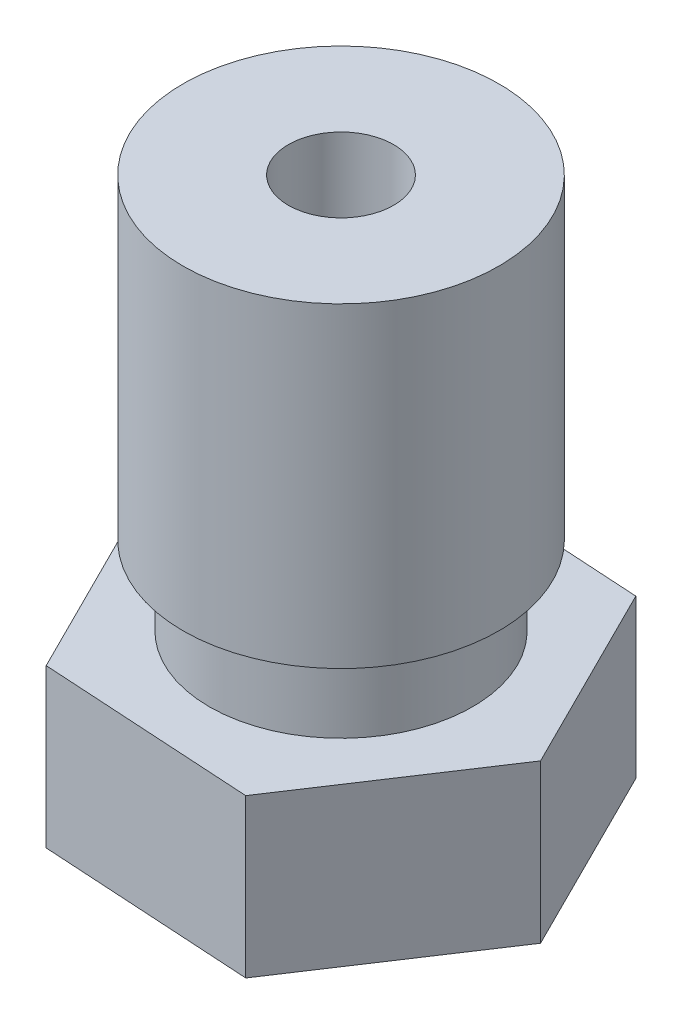
ISO-10303-21;
HEADER;
FILE_DESCRIPTION(('STEP AP214'),'2;1');
FILE_NAME('part.step','',(''),(''),'','','');
FILE_SCHEMA(('AUTOMOTIVE_DESIGN { 1 0 10303 214 1 1 1 1 }'));
ENDSEC;
DATA;
#1=APPLICATION_CONTEXT('core data for automotive mechanical design processes');
#2=APPLICATION_PROTOCOL_DEFINITION('international standard','automotive_design',2000,#1);
#3=PRODUCT_CONTEXT('',#1,'mechanical');
#4=PRODUCT('Part','Part','',(#3));
#5=PRODUCT_RELATED_PRODUCT_CATEGORY('part','',(#4));
#6=PRODUCT_DEFINITION_FORMATION('','',#4);
#7=PRODUCT_DEFINITION_CONTEXT('part definition',#1,'design');
#8=PRODUCT_DEFINITION('design','',#6,#7);
#9=PRODUCT_DEFINITION_SHAPE('','',#8);
#10=(LENGTH_UNIT() NAMED_UNIT(*) SI_UNIT(.MILLI.,.METRE.));
#11=(NAMED_UNIT(*) PLANE_ANGLE_UNIT() SI_UNIT($,.RADIAN.));
#12=(NAMED_UNIT(*) SI_UNIT($,.STERADIAN.) SOLID_ANGLE_UNIT());
#13=UNCERTAINTY_MEASURE_WITH_UNIT(LENGTH_MEASURE(1.E-05),#10,'distance_accuracy_value','');
#14=(GEOMETRIC_REPRESENTATION_CONTEXT(3) GLOBAL_UNCERTAINTY_ASSIGNED_CONTEXT((#13)) GLOBAL_UNIT_ASSIGNED_CONTEXT((#10,
#11,#12)) REPRESENTATION_CONTEXT('',''));
#15=CARTESIAN_POINT('',(0.,0.,0.));
#16=DIRECTION('',(0.,0.,1.));
#17=DIRECTION('',(1.,0.,0.));
#18=AXIS2_PLACEMENT_3D('',#15,#16,#17);
#19=CARTESIAN_POINT('',(3.17129601348423,-4.61407766990291,0.));
#20=DIRECTION('',(0.,1.,0.));
#21=DIRECTION('',(0.,0.,1.));
#22=AXIS2_PLACEMENT_3D('',#19,#20,#21);
#23=PLANE('',#22);
#24=DIRECTION('',(-0.446825402744783,0.,-0.894621182099978));
#25=VECTOR('',#24,1.);
#26=CARTESIAN_POINT('',(4.03408582029404,-4.61407766990291,0.243895321471834));
#27=LINE('',#26,#25);
#28=CARTESIAN_POINT('',(4.03408582029404,-4.61407766990291,0.243895321471834));
#29=VERTEX_POINT('',#28);
#30=CARTESIAN_POINT('',(2.2282624544058,-4.61407766990291,-3.37167314068531));
#31=VERTEX_POINT('',#30);
#32=EDGE_CURVE('E104',#29,#31,#27,.T.);
#33=ORIENTED_EDGE('',*,*,#32,.F.);
#34=DIRECTION('',(0.551351969089854,0.,-0.834272740883184));
#35=VECTOR('',#34,1.);
#36=CARTESIAN_POINT('',(1.80582336588824,-4.61407766990291,3.61556846215715));
#37=LINE('',#36,#35);
#38=CARTESIAN_POINT('',(1.80582336588824,-4.61407766990291,3.61556846215715));
#39=VERTEX_POINT('',#38);
#40=EDGE_CURVE('E107',#39,#29,#37,.T.);
#41=ORIENTED_EDGE('',*,*,#40,.F.);
#42=DIRECTION('',(0.998177371834637,0.,0.0603484412167943));
#43=VECTOR('',#42,1.);
#44=CARTESIAN_POINT('',(-2.2282624544058,-4.61407766990291,3.37167314068531));
#45=LINE('',#44,#43);
#46=CARTESIAN_POINT('',(-2.2282624544058,-4.61407766990291,3.37167314068531));
#47=VERTEX_POINT('',#46);
#48=EDGE_CURVE('E122',#47,#39,#45,.T.);
#49=ORIENTED_EDGE('',*,*,#48,.F.);
#50=DIRECTION('',(0.446825402744783,0.,0.894621182099978));
#51=VECTOR('',#50,1.);
#52=CARTESIAN_POINT('',(-4.03408582029405,-4.61407766990291,-0.243895321471834));
#53=LINE('',#52,#51);
#54=CARTESIAN_POINT('',(-4.03408582029405,-4.61407766990291,-0.243895321471834));
#55=VERTEX_POINT('',#54);
#56=EDGE_CURVE('E97',#55,#47,#53,.T.);
#57=ORIENTED_EDGE('',*,*,#56,.F.);
#58=DIRECTION('',(-0.551351969089854,0.,0.834272740883184));
#59=VECTOR('',#58,1.);
#60=CARTESIAN_POINT('',(-1.80582336588824,-4.61407766990291,-3.61556846215715));
#61=LINE('',#60,#59);
#62=CARTESIAN_POINT('',(-1.80582336588824,-4.61407766990291,-3.61556846215715));
#63=VERTEX_POINT('',#62);
#64=EDGE_CURVE('E65',#63,#55,#61,.T.);
#65=ORIENTED_EDGE('',*,*,#64,.F.);
#66=DIRECTION('',(-0.998177371834637,0.,-0.0603484412167942));
#67=VECTOR('',#66,1.);
#68=CARTESIAN_POINT('',(2.2282624544058,-4.61407766990291,-3.37167314068531));
#69=LINE('',#68,#67);
#70=EDGE_CURVE('E109',#31,#63,#69,.T.);
#71=ORIENTED_EDGE('',*,*,#70,.F.);
#72=EDGE_LOOP('',(#33,#41,#49,#57,#65,#71));
#73=FACE_BOUND('',#72,.T.);
#74=CARTESIAN_POINT('',(0.,-4.61407766990291,0.));
#75=DIRECTION('',(0.,1.,0.));
#76=DIRECTION('',(0.,0.,1.));
#77=AXIS2_PLACEMENT_3D('',#74,#75,#76);
#78=CIRCLE('',#77,3.17129601348423);
#79=CARTESIAN_POINT('',(0.,-4.61407766990291,3.17129601348422));
#80=VERTEX_POINT('',#79);
#81=EDGE_CURVE('E153',#80,#80,#78,.T.);
#82=ORIENTED_EDGE('',*,*,#81,.T.);
#83=EDGE_LOOP('',(#82));
#84=FACE_BOUND('',#83,.T.);
#85=ADVANCED_FACE('F48',(#73,#84),#23,.F.);
#86=CARTESIAN_POINT('',(0.,-6.61407766990291,0.));
#87=DIRECTION('',(0.,1.,0.));
#88=DIRECTION('',(0.,0.,1.));
#89=AXIS2_PLACEMENT_3D('',#86,#87,#88);
#90=CONICAL_SURFACE('',#89,0.315000000000002,0.95993108859688);
#91=CARTESIAN_POINT('',(0.,-6.61407766990291,0.));
#92=DIRECTION('',(0.,1.,0.));
#93=DIRECTION('',(0.,0.,1.));
#94=AXIS2_PLACEMENT_3D('',#91,#92,#93);
#95=CIRCLE('',#94,0.315000000000002);
#96=CARTESIAN_POINT('',(0.,-6.61407766990291,0.315000000000001));
#97=VERTEX_POINT('',#96);
#98=EDGE_CURVE('E150',#97,#97,#95,.T.);
#99=CARTESIAN_POINT('',(0.,-4.61407766990291,3.17129601348422));
#100=CARTESIAN_POINT('',(0.,-4.63491100323624,3.14154293001043));
#101=CARTESIAN_POINT('',(0.,-4.65574433656958,3.11178984653664));
#102=CARTESIAN_POINT('',(0.,-4.69741100323624,3.05228367958905));
#103=CARTESIAN_POINT('',(0.,-4.71824433656958,3.02253059611525));
#104=CARTESIAN_POINT('',(0.,-4.75991100323624,2.96302442916767));
#105=CARTESIAN_POINT('',(0.,-4.78074433656958,2.93327134569387));
#106=CARTESIAN_POINT('',(0.,-4.82241100323624,2.87376517874628));
#107=CARTESIAN_POINT('',(0.,-4.84324433656958,2.84401209527249));
#108=CARTESIAN_POINT('',(0.,-4.88491100323624,2.7845059283249));
#109=CARTESIAN_POINT('',(0.,-4.90574433656958,2.75475284485111));
#110=CARTESIAN_POINT('',(0.,-4.94741100323624,2.69524667790352));
#111=CARTESIAN_POINT('',(0.,-4.96824433656958,2.66549359442973));
#112=CARTESIAN_POINT('',(0.,-5.00991100323624,2.60598742748214));
#113=CARTESIAN_POINT('',(0.,-5.03074433656958,2.57623434400834));
#114=CARTESIAN_POINT('',(0.,-5.07241100323624,2.51672817706076));
#115=CARTESIAN_POINT('',(0.,-5.09324433656958,2.48697509358696));
#116=CARTESIAN_POINT('',(0.,-5.13491100323624,2.42746892663937));
#117=CARTESIAN_POINT('',(0.,-5.15574433656958,2.39771584316558));
#118=CARTESIAN_POINT('',(0.,-5.19741100323624,2.33820967621799));
#119=CARTESIAN_POINT('',(0.,-5.21824433656958,2.3084565927442));
#120=CARTESIAN_POINT('',(0.,-5.25991100323624,2.24895042579661));
#121=CARTESIAN_POINT('',(0.,-5.28074433656958,2.21919734232282));
#122=CARTESIAN_POINT('',(0.,-5.32241100323624,2.15969117537523));
#123=CARTESIAN_POINT('',(0.,-5.34324433656958,2.12993809190143));
#124=CARTESIAN_POINT('',(0.,-5.38491100323624,2.07043192495385));
#125=CARTESIAN_POINT('',(0.,-5.40574433656958,2.04067884148005));
#126=CARTESIAN_POINT('',(0.,-5.44741100323624,1.98117267453246));
#127=CARTESIAN_POINT('',(0.,-5.46824433656958,1.95141959105867));
#128=CARTESIAN_POINT('',(0.,-5.50991100323624,1.89191342411108));
#129=CARTESIAN_POINT('',(0.,-5.53074433656958,1.86216034063729));
#130=CARTESIAN_POINT('',(0.,-5.57241100323624,1.8026541736897));
#131=CARTESIAN_POINT('',(0.,-5.59324433656958,1.77290109021591));
#132=CARTESIAN_POINT('',(0.,-5.63491100323624,1.71339492326832));
#133=CARTESIAN_POINT('',(0.,-5.65574433656958,1.68364183979452));
#134=CARTESIAN_POINT('',(0.,-5.69741100323624,1.62413567284694));
#135=CARTESIAN_POINT('',(0.,-5.71824433656958,1.59438258937314));
#136=CARTESIAN_POINT('',(0.,-5.75991100323624,1.53487642242555));
#137=CARTESIAN_POINT('',(0.,-5.78074433656958,1.50512333895176));
#138=CARTESIAN_POINT('',(0.,-5.82241100323624,1.44561717200417));
#139=CARTESIAN_POINT('',(0.,-5.84324433656958,1.41586408853038));
#140=CARTESIAN_POINT('',(0.,-5.88491100323624,1.35635792158279));
#141=CARTESIAN_POINT('',(0.,-5.90574433656958,1.326604838109));
#142=CARTESIAN_POINT('',(0.,-5.94741100323624,1.26709867116141));
#143=CARTESIAN_POINT('',(0.,-5.96824433656958,1.23734558768761));
#144=CARTESIAN_POINT('',(0.,-6.00991100323624,1.17783942074003));
#145=CARTESIAN_POINT('',(0.,-6.03074433656958,1.14808633726623));
#146=CARTESIAN_POINT('',(0.,-6.07241100323624,1.08858017031864));
#147=CARTESIAN_POINT('',(0.,-6.09324433656958,1.05882708684485));
#148=CARTESIAN_POINT('',(0.,-6.13491100323624,0.999320919897263));
#149=CARTESIAN_POINT('',(0.,-6.15574433656958,0.969567836423469));
#150=CARTESIAN_POINT('',(0.,-6.19741100323624,0.910061669475881));
#151=CARTESIAN_POINT('',(0.,-6.21824433656958,0.880308586002087));
#152=CARTESIAN_POINT('',(0.,-6.25991100323624,0.820802419054499));
#153=CARTESIAN_POINT('',(0.,-6.28074433656958,0.791049335580705));
#154=CARTESIAN_POINT('',(0.,-6.32241100323624,0.731543168633117));
#155=CARTESIAN_POINT('',(0.,-6.34324433656958,0.701790085159323));
#156=CARTESIAN_POINT('',(0.,-6.38491100323624,0.642283918211735));
#157=CARTESIAN_POINT('',(0.,-6.40574433656958,0.612530834737941));
#158=CARTESIAN_POINT('',(0.,-6.44741100323624,0.553024667790353));
#159=CARTESIAN_POINT('',(0.,-6.46824433656958,0.523271584316559));
#160=CARTESIAN_POINT('',(0.,-6.50991100323624,0.463765417368971));
#161=CARTESIAN_POINT('',(0.,-6.53074433656958,0.434012333895177));
#162=CARTESIAN_POINT('',(0.,-6.57241100323624,0.374506166947589));
#163=CARTESIAN_POINT('',(0.,-6.59324433656958,0.344753083473795));
#164=CARTESIAN_POINT('',(0.,-6.61407766990291,0.315000000000001));
#165=B_SPLINE_CURVE_WITH_KNOTS('',3,(#99,#100,#101,#102,#103,#104,#105,#106,#107,#108,#109,#110,
#111,#112,#113,#114,#115,#116,#117,#118,#119,#120,#121,#122,#123,#124,#125,#126,#127,#128,#129,
#130,#131,#132,#133,#134,#135,#136,#137,#138,#139,#140,#141,#142,#143,#144,#145,#146,#147,#148,
#149,#150,#151,#152,#153,#154,#155,#156,#157,#158,#159,#160,#161,#162,#163,#164),.UNSPECIFIED.,
.F.,.F.,(4,2,2,2,2,2,2,2,2,2,2,2,2,2,2,2,2,2,2,2,2,2,2,2,2,2,2,2,2,2,2,2,4),(0.,
0.108965424726318,0.217930849452637,0.326896274178955,0.435861698905274,0.544827123631592,
0.653792548357911,0.762757973084229,0.871723397810548,0.980688822536867,1.08965424726319,
1.1986196719895,1.30758509671582,1.41655052144214,1.52551594616846,1.63448137089478,
1.7434467956211,1.85241222034741,1.96137764507373,2.07034306980005,2.17930849452637,
2.28827391925269,2.39723934397901,2.50620476870533,2.61517019343164,2.72413561815796,
2.83310104288428,2.9420664676106,3.05103189233692,3.15999731706324,3.26896274178955,
3.37792816651587,3.48689359124219),.UNSPECIFIED.);
#166=EDGE_CURVE('BSEAM232',#80,#97,#165,.T.);
#167=ORIENTED_EDGE('',*,*,#81,.F.);
#168=ORIENTED_EDGE('',*,*,#98,.T.);
#169=ORIENTED_EDGE('',*,*,#166,.T.);
#170=ORIENTED_EDGE('',*,*,#166,.F.);
#171=EDGE_LOOP('',(#167,#169,#168,#170));
#172=FACE_BOUND('',#171,.T.);
#173=ADVANCED_FACE('F232',(#172),#90,.T.);
#174=CARTESIAN_POINT('',(0.315000000000002,-6.61407766990291,0.));
#175=DIRECTION('',(0.,1.,0.));
#176=DIRECTION('',(0.,0.,1.));
#177=AXIS2_PLACEMENT_3D('',#174,#175,#176);
#178=PLANE('',#177);
#179=ORIENTED_EDGE('',*,*,#98,.F.);
#180=EDGE_LOOP('',(#179));
#181=FACE_BOUND('',#180,.T.);
#182=CARTESIAN_POINT('',(0.,-6.61407766990291,0.));
#183=DIRECTION('',(0.,1.,0.));
#184=DIRECTION('',(0.,0.,1.));
#185=AXIS2_PLACEMENT_3D('',#182,#183,#184);
#186=CIRCLE('',#185,0.150000000000001);
#187=CARTESIAN_POINT('',(0.,-6.61407766990291,0.150000000000001));
#188=VERTEX_POINT('',#187);
#189=EDGE_CURVE('E147',#188,#188,#186,.T.);
#190=ORIENTED_EDGE('',*,*,#189,.T.);
#191=EDGE_LOOP('',(#190));
#192=FACE_BOUND('',#191,.T.);
#193=ADVANCED_FACE('F237',(#181,#192),#178,.F.);
#194=CARTESIAN_POINT('',(0.,5.88592233009709,0.));
#195=DIRECTION('',(0.,1.,0.));
#196=DIRECTION('',(0.,0.,1.));
#197=AXIS2_PLACEMENT_3D('',#194,#195,#196);
#198=CYLINDRICAL_SURFACE('',#197,0.150000000000001);
#199=ORIENTED_EDGE('',*,*,#189,.F.);
#200=EDGE_LOOP('',(#199));
#201=FACE_BOUND('',#200,.T.);
#202=CARTESIAN_POINT('',(0.,-6.11407766990291,0.));
#203=DIRECTION('',(0.,1.,0.));
#204=DIRECTION('',(0.,0.,1.));
#205=AXIS2_PLACEMENT_3D('',#202,#203,#204);
#206=CIRCLE('',#205,0.150000000000001);
#207=CARTESIAN_POINT('',(0.,-6.11407766990291,0.150000000000001));
#208=VERTEX_POINT('',#207);
#209=EDGE_CURVE('E144',#208,#208,#206,.T.);
#210=ORIENTED_EDGE('',*,*,#209,.T.);
#211=EDGE_LOOP('',(#210));
#212=FACE_BOUND('',#211,.T.);
#213=ADVANCED_FACE('F334',(#201,#212),#198,.F.);
#214=CARTESIAN_POINT('',(0.,-5.7640776699029,0.));
#215=DIRECTION('',(0.,1.,0.));
#216=DIRECTION('',(0.,0.,1.));
#217=AXIS2_PLACEMENT_3D('',#214,#215,#216);
#218=CONICAL_SURFACE('',#217,0.500000000000001,0.785398163397437);
#219=CARTESIAN_POINT('',(0.,-5.7640776699029,0.));
#220=DIRECTION('',(0.,1.,0.));
#221=DIRECTION('',(0.,0.,1.));
#222=AXIS2_PLACEMENT_3D('',#219,#220,#221);
#223=CIRCLE('',#222,0.500000000000001);
#224=CARTESIAN_POINT('',(0.,-5.7640776699029,0.500000000000001));
#225=VERTEX_POINT('',#224);
#226=EDGE_CURVE('E141',#225,#225,#223,.T.);
#227=CARTESIAN_POINT('',(0.,-6.11407766990291,0.150000000000001));
#228=CARTESIAN_POINT('',(0.,-6.11043183656958,0.153645833333334));
#229=CARTESIAN_POINT('',(0.,-6.10678600323624,0.157291666666668));
#230=CARTESIAN_POINT('',(0.,-6.09949433656958,0.164583333333334));
#231=CARTESIAN_POINT('',(0.,-6.09584850323624,0.168229166666668));
#232=CARTESIAN_POINT('',(0.,-6.08855683656958,0.175520833333334));
#233=CARTESIAN_POINT('',(0.,-6.08491100323624,0.179166666666668));
#234=CARTESIAN_POINT('',(0.,-6.07761933656958,0.186458333333334));
#235=CARTESIAN_POINT('',(0.,-6.07397350323624,0.190104166666668));
#236=CARTESIAN_POINT('',(0.,-6.06668183656958,0.197395833333334));
#237=CARTESIAN_POINT('',(0.,-6.06303600323624,0.201041666666668));
#238=CARTESIAN_POINT('',(0.,-6.05574433656958,0.208333333333334));
#239=CARTESIAN_POINT('',(0.,-6.05209850323624,0.211979166666668));
#240=CARTESIAN_POINT('',(0.,-6.04480683656958,0.219270833333334));
#241=CARTESIAN_POINT('',(0.,-6.04116100323624,0.222916666666668));
#242=CARTESIAN_POINT('',(0.,-6.03386933656958,0.230208333333334));
#243=CARTESIAN_POINT('',(0.,-6.03022350323624,0.233854166666668));
#244=CARTESIAN_POINT('',(0.,-6.02293183656957,0.241145833333334));
#245=CARTESIAN_POINT('',(0.,-6.01928600323624,0.244791666666668));
#246=CARTESIAN_POINT('',(0.,-6.01199433656957,0.252083333333334));
#247=CARTESIAN_POINT('',(0.,-6.00834850323624,0.255729166666668));
#248=CARTESIAN_POINT('',(0.,-6.00105683656957,0.263020833333334));
#249=CARTESIAN_POINT('',(0.,-5.99741100323624,0.266666666666668));
#250=CARTESIAN_POINT('',(0.,-5.99011933656957,0.273958333333334));
#251=CARTESIAN_POINT('',(0.,-5.98647350323624,0.277604166666668));
#252=CARTESIAN_POINT('',(0.,-5.97918183656957,0.284895833333334));
#253=CARTESIAN_POINT('',(0.,-5.97553600323624,0.288541666666668));
#254=CARTESIAN_POINT('',(0.,-5.96824433656957,0.295833333333334));
#255=CARTESIAN_POINT('',(0.,-5.96459850323624,0.299479166666668));
#256=CARTESIAN_POINT('',(0.,-5.95730683656957,0.306770833333334));
#257=CARTESIAN_POINT('',(0.,-5.95366100323624,0.310416666666668));
#258=CARTESIAN_POINT('',(0.,-5.94636933656957,0.317708333333334));
#259=CARTESIAN_POINT('',(0.,-5.94272350323624,0.321354166666668));
#260=CARTESIAN_POINT('',(0.,-5.93543183656957,0.328645833333334));
#261=CARTESIAN_POINT('',(0.,-5.93178600323624,0.332291666666668));
#262=CARTESIAN_POINT('',(0.,-5.92449433656957,0.339583333333334));
#263=CARTESIAN_POINT('',(0.,-5.92084850323624,0.343229166666668));
#264=CARTESIAN_POINT('',(0.,-5.91355683656957,0.350520833333334));
#265=CARTESIAN_POINT('',(0.,-5.90991100323624,0.354166666666668));
#266=CARTESIAN_POINT('',(0.,-5.90261933656957,0.361458333333334));
#267=CARTESIAN_POINT('',(0.,-5.89897350323624,0.365104166666668));
#268=CARTESIAN_POINT('',(0.,-5.89168183656957,0.372395833333334));
#269=CARTESIAN_POINT('',(0.,-5.88803600323624,0.376041666666668));
#270=CARTESIAN_POINT('',(0.,-5.88074433656957,0.383333333333334));
#271=CARTESIAN_POINT('',(0.,-5.87709850323624,0.386979166666668));
#272=CARTESIAN_POINT('',(0.,-5.86980683656957,0.394270833333334));
#273=CARTESIAN_POINT('',(0.,-5.86616100323624,0.397916666666668));
#274=CARTESIAN_POINT('',(0.,-5.85886933656957,0.405208333333334));
#275=CARTESIAN_POINT('',(0.,-5.85522350323624,0.408854166666668));
#276=CARTESIAN_POINT('',(0.,-5.84793183656957,0.416145833333334));
#277=CARTESIAN_POINT('',(0.,-5.84428600323624,0.419791666666668));
#278=CARTESIAN_POINT('',(0.,-5.83699433656957,0.427083333333334));
#279=CARTESIAN_POINT('',(0.,-5.83334850323624,0.430729166666668));
#280=CARTESIAN_POINT('',(0.,-5.82605683656957,0.438020833333334));
#281=CARTESIAN_POINT('',(0.,-5.82241100323624,0.441666666666668));
#282=CARTESIAN_POINT('',(0.,-5.81511933656957,0.448958333333334));
#283=CARTESIAN_POINT('',(0.,-5.81147350323624,0.452604166666668));
#284=CARTESIAN_POINT('',(0.,-5.80418183656957,0.459895833333334));
#285=CARTESIAN_POINT('',(0.,-5.80053600323624,0.463541666666668));
#286=CARTESIAN_POINT('',(0.,-5.79324433656957,0.470833333333334));
#287=CARTESIAN_POINT('',(0.,-5.78959850323624,0.474479166666668));
#288=CARTESIAN_POINT('',(0.,-5.78230683656957,0.481770833333334));
#289=CARTESIAN_POINT('',(0.,-5.77866100323624,0.485416666666668));
#290=CARTESIAN_POINT('',(0.,-5.77136933656957,0.492708333333334));
#291=CARTESIAN_POINT('',(0.,-5.76772350323624,0.496354166666668));
#292=CARTESIAN_POINT('',(0.,-5.7640776699029,0.500000000000001));
#293=B_SPLINE_CURVE_WITH_KNOTS('',3,(#227,#228,#229,#230,#231,#232,#233,#234,#235,#236,#237,
#238,#239,#240,#241,#242,#243,#244,#245,#246,#247,#248,#249,#250,#251,#252,#253,#254,#255,#256,
#257,#258,#259,#260,#261,#262,#263,#264,#265,#266,#267,#268,#269,#270,#271,#272,#273,#274,#275,
#276,#277,#278,#279,#280,#281,#282,#283,#284,#285,#286,#287,#288,#289,#290,#291,#292),
.UNSPECIFIED.,.F.,.F.,(4,2,2,2,2,2,2,2,2,2,2,2,2,2,2,2,2,2,2,2,2,2,2,2,2,2,2,2,2,2,2,2,4),(0.,
0.0154679608384555,0.0309359216769116,0.0464038825153677,0.0618718433538232,0.0773398041922793,
0.0928077650307354,0.108275725869191,0.123743686707647,0.139211647546103,0.154679608384559,
0.170147569223015,0.185615530061471,0.201083490899926,0.216551451738382,0.232019412576839,
0.247487373415294,0.26295533425375,0.278423295092206,0.293891255930662,0.309359216769118,
0.324827177607574,0.34029513844603,0.355763099284485,0.371231060122941,0.386699020961398,
0.402166981799853,0.417634942638309,0.433102903476765,0.448570864315221,0.464038825153677,
0.479506785992133,0.494974746830589),.UNSPECIFIED.);
#294=EDGE_CURVE('BSEAM324',#208,#225,#293,.T.);
#295=ORIENTED_EDGE('',*,*,#209,.F.);
#296=ORIENTED_EDGE('',*,*,#226,.T.);
#297=ORIENTED_EDGE('',*,*,#294,.T.);
#298=ORIENTED_EDGE('',*,*,#294,.F.);
#299=EDGE_LOOP('',(#295,#297,#296,#298));
#300=FACE_BOUND('',#299,.T.);
#301=ADVANCED_FACE('F324',(#300),#218,.F.);
#302=CARTESIAN_POINT('',(0.,5.88592233009709,0.));
#303=DIRECTION('',(0.,1.,0.));
#304=DIRECTION('',(0.,0.,1.));
#305=AXIS2_PLACEMENT_3D('',#302,#303,#304);
#306=CYLINDRICAL_SURFACE('',#305,0.500000000000001);
#307=ORIENTED_EDGE('',*,*,#226,.F.);
#308=EDGE_LOOP('',(#307));
#309=FACE_BOUND('',#308,.T.);
#310=CARTESIAN_POINT('',(0.,-5.11407766990292,0.));
#311=DIRECTION('',(0.,1.,0.));
#312=DIRECTION('',(0.,0.,1.));
#313=AXIS2_PLACEMENT_3D('',#310,#311,#312);
#314=CIRCLE('',#313,0.500000000000001);
#315=CARTESIAN_POINT('',(0.,-5.11407766990292,0.500000000000001));
#316=VERTEX_POINT('',#315);
#317=EDGE_CURVE('E138',#316,#316,#314,.T.);
#318=ORIENTED_EDGE('',*,*,#317,.T.);
#319=EDGE_LOOP('',(#318));
#320=FACE_BOUND('',#319,.T.);
#321=ADVANCED_FACE('F227',(#309,#320),#306,.F.);
#322=CARTESIAN_POINT('',(0.,-4.61407766990291,0.));
#323=DIRECTION('',(0.,1.,0.));
#324=DIRECTION('',(0.,0.,1.));
#325=AXIS2_PLACEMENT_3D('',#322,#323,#324);
#326=CONICAL_SURFACE('',#325,1.,0.785398163397438);
#327=ORIENTED_EDGE('',*,*,#317,.F.);
#328=EDGE_LOOP('',(#327));
#329=FACE_BOUND('',#328,.T.);
#330=CARTESIAN_POINT('',(0.,-4.61407766990291,0.));
#331=DIRECTION('',(0.,1.,0.));
#332=DIRECTION('',(0.,0.,1.));
#333=AXIS2_PLACEMENT_3D('',#330,#331,#332);
#334=CIRCLE('',#333,1.);
#335=CARTESIAN_POINT('',(0.,-4.61407766990291,1.));
#336=VERTEX_POINT('',#335);
#337=EDGE_CURVE('E208',#336,#336,#334,.T.);
#338=ORIENTED_EDGE('',*,*,#337,.T.);
#339=EDGE_LOOP('',(#338));
#340=FACE_BOUND('',#339,.T.);
#341=ADVANCED_FACE('F220',(#329,#340),#326,.F.);
#342=CARTESIAN_POINT('',(-4.03408582029405,-4.61407766990291,-0.243895321471834));
#343=DIRECTION('',(-0.894621182099978,0.,0.446825402744783));
#344=DIRECTION('',(0.446825402744783,0.,0.894621182099978));
#345=AXIS2_PLACEMENT_3D('',#342,#343,#344);
#346=PLANE('',#345);
#347=DIRECTION('',(0.,1.,0.));
#348=VECTOR('',#347,1.);
#349=CARTESIAN_POINT('',(-2.2282624544058,-4.61407766990291,3.37167314068531));
#350=LINE('',#349,#348);
#351=CARTESIAN_POINT('',(-2.2282624544058,-1.61407766990291,3.37167314068531));
#352=VERTEX_POINT('',#351);
#353=EDGE_CURVE('E129',#47,#352,#350,.T.);
#354=ORIENTED_EDGE('',*,*,#353,.T.);
#355=DIRECTION('',(0.446825402744783,0.,0.894621182099978));
#356=VECTOR('',#355,1.);
#357=CARTESIAN_POINT('',(-4.03408582029405,-1.61407766990291,-0.243895321471834));
#358=LINE('',#357,#356);
#359=CARTESIAN_POINT('',(-4.03408582029405,-1.61407766990291,-0.243895321471834));
#360=VERTEX_POINT('',#359);
#361=EDGE_CURVE('E195',#360,#352,#358,.T.);
#362=ORIENTED_EDGE('',*,*,#361,.F.);
#363=DIRECTION('',(0.,1.,0.));
#364=VECTOR('',#363,1.);
#365=CARTESIAN_POINT('',(-4.03408582029405,-4.61407766990291,-0.243895321471834));
#366=LINE('',#365,#364);
#367=EDGE_CURVE('E135',#55,#360,#366,.T.);
#368=ORIENTED_EDGE('',*,*,#367,.F.);
#369=ORIENTED_EDGE('',*,*,#56,.T.);
#370=EDGE_LOOP('',(#354,#362,#368,#369));
#371=FACE_BOUND('',#370,.T.);
#372=ADVANCED_FACE('F218',(#371),#346,.T.);
#373=CARTESIAN_POINT('',(-2.2282624544058,-4.61407766990291,3.37167314068531));
#374=DIRECTION('',(-0.0603484412167943,0.,0.998177371834637));
#375=DIRECTION('',(0.998177371834637,0.,0.0603484412167943));
#376=AXIS2_PLACEMENT_3D('',#373,#374,#375);
#377=PLANE('',#376);
#378=DIRECTION('',(0.,1.,0.));
#379=VECTOR('',#378,1.);
#380=CARTESIAN_POINT('',(1.80582336588824,-4.61407766990291,3.61556846215715));
#381=LINE('',#380,#379);
#382=CARTESIAN_POINT('',(1.80582336588824,-1.61407766990291,3.61556846215715));
#383=VERTEX_POINT('',#382);
#384=EDGE_CURVE('E121',#39,#383,#381,.T.);
#385=ORIENTED_EDGE('',*,*,#384,.T.);
#386=DIRECTION('',(0.998177371834637,0.,0.0603484412167943));
#387=VECTOR('',#386,1.);
#388=CARTESIAN_POINT('',(-2.2282624544058,-1.61407766990291,3.37167314068531));
#389=LINE('',#388,#387);
#390=EDGE_CURVE('E192',#352,#383,#389,.T.);
#391=ORIENTED_EDGE('',*,*,#390,.F.);
#392=ORIENTED_EDGE('',*,*,#353,.F.);
#393=ORIENTED_EDGE('',*,*,#48,.T.);
#394=EDGE_LOOP('',(#385,#391,#392,#393));
#395=FACE_BOUND('',#394,.T.);
#396=ADVANCED_FACE('F200',(#395),#377,.T.);
#397=CARTESIAN_POINT('',(1.80582336588824,-4.61407766990291,3.61556846215715));
#398=DIRECTION('',(0.834272740883184,0.,0.551351969089854));
#399=DIRECTION('',(0.551351969089854,0.,-0.834272740883184));
#400=AXIS2_PLACEMENT_3D('',#397,#398,#399);
#401=PLANE('',#400);
#402=DIRECTION('',(0.551351969089854,0.,-0.834272740883184));
#403=VECTOR('',#402,1.);
#404=CARTESIAN_POINT('',(1.80582336588824,-1.61407766990291,3.61556846215715));
#405=LINE('',#404,#403);
#406=CARTESIAN_POINT('',(4.03408582029404,-1.61407766990291,0.243895321471834));
#407=VERTEX_POINT('',#406);
#408=EDGE_CURVE('E193',#383,#407,#405,.T.);
#409=ORIENTED_EDGE('',*,*,#408,.F.);
#410=ORIENTED_EDGE('',*,*,#384,.F.);
#411=ORIENTED_EDGE('',*,*,#40,.T.);
#412=DIRECTION('',(0.,1.,0.));
#413=VECTOR('',#412,1.);
#414=CARTESIAN_POINT('',(4.03408582029404,-4.61407766990291,0.243895321471834));
#415=LINE('',#414,#413);
#416=EDGE_CURVE('E119',#29,#407,#415,.T.);
#417=ORIENTED_EDGE('',*,*,#416,.T.);
#418=EDGE_LOOP('',(#409,#410,#411,#417));
#419=FACE_BOUND('',#418,.T.);
#420=ADVANCED_FACE('F118',(#419),#401,.T.);
#421=CARTESIAN_POINT('',(4.03408582029404,-4.61407766990291,0.243895321471834));
#422=DIRECTION('',(0.894621182099978,0.,-0.446825402744783));
#423=DIRECTION('',(-0.446825402744783,0.,-0.894621182099978));
#424=AXIS2_PLACEMENT_3D('',#421,#422,#423);
#425=PLANE('',#424);
#426=DIRECTION('',(0.,1.,0.));
#427=VECTOR('',#426,1.);
#428=CARTESIAN_POINT('',(2.2282624544058,-4.61407766990291,-3.37167314068531));
#429=LINE('',#428,#427);
#430=CARTESIAN_POINT('',(2.2282624544058,-1.61407766990291,-3.37167314068531));
#431=VERTEX_POINT('',#430);
#432=EDGE_CURVE('E125',#31,#431,#429,.T.);
#433=ORIENTED_EDGE('',*,*,#432,.T.);
#434=DIRECTION('',(-0.446825402744783,0.,-0.894621182099978));
#435=VECTOR('',#434,1.);
#436=CARTESIAN_POINT('',(4.03408582029404,-1.61407766990291,0.243895321471834));
#437=LINE('',#436,#435);
#438=EDGE_CURVE('E87',#407,#431,#437,.T.);
#439=ORIENTED_EDGE('',*,*,#438,.F.);
#440=ORIENTED_EDGE('',*,*,#416,.F.);
#441=ORIENTED_EDGE('',*,*,#32,.T.);
#442=EDGE_LOOP('',(#433,#439,#440,#441));
#443=FACE_BOUND('',#442,.T.);
#444=ADVANCED_FACE('F124',(#443),#425,.T.);
#445=CARTESIAN_POINT('',(2.2282624544058,-4.61407766990291,-3.37167314068531));
#446=DIRECTION('',(0.0603484412167942,0.,-0.998177371834637));
#447=DIRECTION('',(-0.998177371834637,0.,-0.0603484412167942));
#448=AXIS2_PLACEMENT_3D('',#445,#446,#447);
#449=PLANE('',#448);
#450=DIRECTION('',(0.,1.,0.));
#451=VECTOR('',#450,1.);
#452=CARTESIAN_POINT('',(-1.80582336588824,-4.61407766990291,-3.61556846215715));
#453=LINE('',#452,#451);
#454=CARTESIAN_POINT('',(-1.80582336588824,-1.61407766990291,-3.61556846215715));
#455=VERTEX_POINT('',#454);
#456=EDGE_CURVE('E127',#63,#455,#453,.T.);
#457=ORIENTED_EDGE('',*,*,#456,.T.);
#458=DIRECTION('',(-0.998177371834637,0.,-0.0603484412167942));
#459=VECTOR('',#458,1.);
#460=CARTESIAN_POINT('',(2.2282624544058,-1.61407766990291,-3.37167314068531));
#461=LINE('',#460,#459);
#462=EDGE_CURVE('E91',#431,#455,#461,.T.);
#463=ORIENTED_EDGE('',*,*,#462,.F.);
#464=ORIENTED_EDGE('',*,*,#432,.F.);
#465=ORIENTED_EDGE('',*,*,#70,.T.);
#466=EDGE_LOOP('',(#457,#463,#464,#465));
#467=FACE_BOUND('',#466,.T.);
#468=ADVANCED_FACE('F214',(#467),#449,.T.);
#469=CARTESIAN_POINT('',(-1.80582336588824,-4.61407766990291,-3.61556846215715));
#470=DIRECTION('',(-0.834272740883184,0.,-0.551351969089854));
#471=DIRECTION('',(-0.551351969089854,0.,0.834272740883184));
#472=AXIS2_PLACEMENT_3D('',#469,#470,#471);
#473=PLANE('',#472);
#474=ORIENTED_EDGE('',*,*,#367,.T.);
#475=DIRECTION('',(-0.551351969089854,0.,0.834272740883184));
#476=VECTOR('',#475,1.);
#477=CARTESIAN_POINT('',(-1.80582336588824,-1.61407766990291,-3.61556846215715));
#478=LINE('',#477,#476);
#479=EDGE_CURVE('E206',#455,#360,#478,.T.);
#480=ORIENTED_EDGE('',*,*,#479,.F.);
#481=ORIENTED_EDGE('',*,*,#456,.F.);
#482=ORIENTED_EDGE('',*,*,#64,.T.);
#483=EDGE_LOOP('',(#474,#480,#481,#482));
#484=FACE_BOUND('',#483,.T.);
#485=ADVANCED_FACE('F180',(#484),#473,.T.);
#486=CARTESIAN_POINT('',(3.,-0.11407766990291,0.));
#487=DIRECTION('',(0.,1.,0.));
#488=DIRECTION('',(0.,0.,1.));
#489=AXIS2_PLACEMENT_3D('',#486,#487,#488);
#490=PLANE('',#489);
#491=CARTESIAN_POINT('',(0.,-0.11407766990291,0.));
#492=DIRECTION('',(0.,1.,0.));
#493=DIRECTION('',(0.,0.,1.));
#494=AXIS2_PLACEMENT_3D('',#491,#492,#493);
#495=CIRCLE('',#494,3.);
#496=CARTESIAN_POINT('',(0.,-0.11407766990291,3.));
#497=VERTEX_POINT('',#496);
#498=EDGE_CURVE('E162',#497,#497,#495,.T.);
#499=ORIENTED_EDGE('',*,*,#498,.F.);
#500=EDGE_LOOP('',(#499));
#501=FACE_BOUND('',#500,.T.);
#502=CARTESIAN_POINT('',(0.,-0.11407766990291,0.));
#503=DIRECTION('',(0.,1.,0.));
#504=DIRECTION('',(0.,0.,1.));
#505=AXIS2_PLACEMENT_3D('',#502,#503,#504);
#506=CIRCLE('',#505,2.5);
#507=CARTESIAN_POINT('',(0.,-0.11407766990291,2.5));
#508=VERTEX_POINT('',#507);
#509=EDGE_CURVE('E159',#508,#508,#506,.T.);
#510=ORIENTED_EDGE('',*,*,#509,.T.);
#511=EDGE_LOOP('',(#510));
#512=FACE_BOUND('',#511,.T.);
#513=ADVANCED_FACE('F176',(#501,#512),#490,.F.);
#514=CARTESIAN_POINT('',(0.,5.88592233009709,0.));
#515=DIRECTION('',(0.,1.,0.));
#516=DIRECTION('',(0.,0.,1.));
#517=AXIS2_PLACEMENT_3D('',#514,#515,#516);
#518=CYLINDRICAL_SURFACE('',#517,2.5);
#519=ORIENTED_EDGE('',*,*,#509,.F.);
#520=EDGE_LOOP('',(#519));
#521=FACE_BOUND('',#520,.T.);
#522=CARTESIAN_POINT('',(0.,-1.61407766990291,0.));
#523=DIRECTION('',(0.,1.,0.));
#524=DIRECTION('',(0.,0.,1.));
#525=AXIS2_PLACEMENT_3D('',#522,#523,#524);
#526=CIRCLE('',#525,2.5);
#527=CARTESIAN_POINT('',(0.,-1.61407766990291,2.5));
#528=VERTEX_POINT('',#527);
#529=EDGE_CURVE('E156',#528,#528,#526,.T.);
#530=ORIENTED_EDGE('',*,*,#529,.T.);
#531=EDGE_LOOP('',(#530));
#532=FACE_BOUND('',#531,.T.);
#533=ADVANCED_FACE('F179',(#521,#532),#518,.T.);
#534=CARTESIAN_POINT('',(2.5,-1.61407766990291,0.));
#535=DIRECTION('',(0.,-1.,0.));
#536=DIRECTION('',(0.,0.,-1.));
#537=AXIS2_PLACEMENT_3D('',#534,#535,#536);
#538=PLANE('',#537);
#539=ORIENTED_EDGE('',*,*,#529,.F.);
#540=EDGE_LOOP('',(#539));
#541=FACE_BOUND('',#540,.T.);
#542=ORIENTED_EDGE('',*,*,#390,.T.);
#543=ORIENTED_EDGE('',*,*,#408,.T.);
#544=ORIENTED_EDGE('',*,*,#438,.T.);
#545=ORIENTED_EDGE('',*,*,#462,.T.);
#546=ORIENTED_EDGE('',*,*,#479,.T.);
#547=ORIENTED_EDGE('',*,*,#361,.T.);
#548=EDGE_LOOP('',(#542,#543,#544,#545,#546,#547));
#549=FACE_BOUND('',#548,.T.);
#550=ADVANCED_FACE('F172',(#541,#549),#538,.F.);
#551=CARTESIAN_POINT('',(0.,5.88592233009709,0.));
#552=DIRECTION('',(0.,1.,0.));
#553=DIRECTION('',(0.,0.,1.));
#554=AXIS2_PLACEMENT_3D('',#551,#552,#553);
#555=CYLINDRICAL_SURFACE('',#554,3.);
#556=CARTESIAN_POINT('',(0.,5.88592233009709,0.));
#557=DIRECTION('',(0.,1.,0.));
#558=DIRECTION('',(0.,0.,1.));
#559=AXIS2_PLACEMENT_3D('',#556,#557,#558);
#560=CIRCLE('',#559,3.);
#561=CARTESIAN_POINT('',(0.,5.88592233009709,3.));
#562=VERTEX_POINT('',#561);
#563=EDGE_CURVE('E57',#562,#562,#560,.T.);
#564=ORIENTED_EDGE('',*,*,#563,.F.);
#565=EDGE_LOOP('',(#564));
#566=FACE_BOUND('',#565,.T.);
#567=ORIENTED_EDGE('',*,*,#498,.T.);
#568=EDGE_LOOP('',(#567));
#569=FACE_BOUND('',#568,.T.);
#570=ADVANCED_FACE('F169',(#566,#569),#555,.T.);
#571=CARTESIAN_POINT('',(1.,5.88592233009709,0.));
#572=DIRECTION('',(0.,-1.,0.));
#573=DIRECTION('',(0.,0.,-1.));
#574=AXIS2_PLACEMENT_3D('',#571,#572,#573);
#575=PLANE('',#574);
#576=CARTESIAN_POINT('',(0.,5.88592233009709,0.));
#577=DIRECTION('',(0.,1.,0.));
#578=DIRECTION('',(0.,0.,1.));
#579=AXIS2_PLACEMENT_3D('',#576,#577,#578);
#580=CIRCLE('',#579,1.);
#581=CARTESIAN_POINT('',(0.,5.88592233009709,1.));
#582=VERTEX_POINT('',#581);
#583=EDGE_CURVE('E13',#582,#582,#580,.T.);
#584=ORIENTED_EDGE('',*,*,#583,.F.);
#585=EDGE_LOOP('',(#584));
#586=FACE_BOUND('',#585,.T.);
#587=ORIENTED_EDGE('',*,*,#563,.T.);
#588=EDGE_LOOP('',(#587));
#589=FACE_BOUND('',#588,.T.);
#590=ADVANCED_FACE('F167',(#586,#589),#575,.F.);
#591=CARTESIAN_POINT('',(0.,5.88592233009709,0.));
#592=DIRECTION('',(0.,1.,0.));
#593=DIRECTION('',(0.,0.,1.));
#594=AXIS2_PLACEMENT_3D('',#591,#592,#593);
#595=CYLINDRICAL_SURFACE('',#594,1.);
#596=ORIENTED_EDGE('',*,*,#583,.T.);
#597=EDGE_LOOP('',(#596));
#598=FACE_BOUND('',#597,.T.);
#599=ORIENTED_EDGE('',*,*,#337,.F.);
#600=EDGE_LOOP('',(#599));
#601=FACE_BOUND('',#600,.T.);
#602=ADVANCED_FACE('F50',(#598,#601),#595,.F.);
#603=CLOSED_SHELL('',(#85,#173,#193,#213,#301,#321,#341,#372,#396,#420,#444,#468,#485,#513,#533,
#550,#570,#590,#602));
#604=MANIFOLD_SOLID_BREP('B2',#603);
#605=ADVANCED_BREP_SHAPE_REPRESENTATION('',(#18,#604),#14);
#606=SHAPE_DEFINITION_REPRESENTATION(#9,#605);
ENDSEC;
END-ISO-10303-21;
